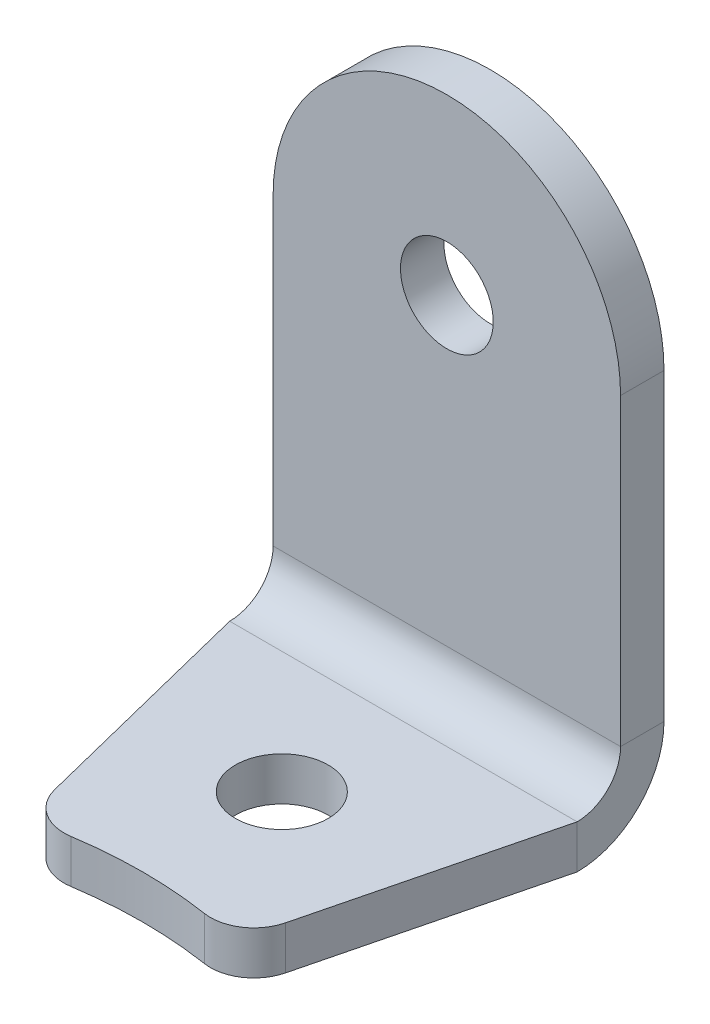
ISO-10303-21;
HEADER;
FILE_DESCRIPTION(('STEP AP214'),'2;1');
FILE_NAME('part.step','',(''),(''),'','','');
FILE_SCHEMA(('AUTOMOTIVE_DESIGN { 1 0 10303 214 1 1 1 1 }'));
ENDSEC;
DATA;
#1=APPLICATION_CONTEXT('core data for automotive mechanical design processes');
#2=APPLICATION_PROTOCOL_DEFINITION('international standard','automotive_design',2000,#1);
#3=PRODUCT_CONTEXT('',#1,'mechanical');
#4=PRODUCT('Part','Part','',(#3));
#5=PRODUCT_RELATED_PRODUCT_CATEGORY('part','',(#4));
#6=PRODUCT_DEFINITION_FORMATION('','',#4);
#7=PRODUCT_DEFINITION_CONTEXT('part definition',#1,'design');
#8=PRODUCT_DEFINITION('design','',#6,#7);
#9=PRODUCT_DEFINITION_SHAPE('','',#8);
#10=(LENGTH_UNIT() NAMED_UNIT(*) SI_UNIT(.MILLI.,.METRE.));
#11=(NAMED_UNIT(*) PLANE_ANGLE_UNIT() SI_UNIT($,.RADIAN.));
#12=(NAMED_UNIT(*) SI_UNIT($,.STERADIAN.) SOLID_ANGLE_UNIT());
#13=UNCERTAINTY_MEASURE_WITH_UNIT(LENGTH_MEASURE(1.E-05),#10,'distance_accuracy_value','');
#14=(GEOMETRIC_REPRESENTATION_CONTEXT(3) GLOBAL_UNCERTAINTY_ASSIGNED_CONTEXT((#13)) GLOBAL_UNIT_ASSIGNED_CONTEXT((#10,
#11,#12)) REPRESENTATION_CONTEXT('',''));
#15=CARTESIAN_POINT('',(0.,0.,0.));
#16=DIRECTION('',(0.,0.,1.));
#17=DIRECTION('',(1.,0.,0.));
#18=AXIS2_PLACEMENT_3D('',#15,#16,#17);
#19=CARTESIAN_POINT('',(-12.7,38.227,-57.1500000000001));
#20=DIRECTION('',(1.,0.,0.));
#21=DIRECTION('',(0.,0.,-1.));
#22=AXIS2_PLACEMENT_3D('',#19,#20,#21);
#23=PLANE('',#22);
#24=DIRECTION('',(0.,0.,-1.));
#25=VECTOR('',#24,1.);
#26=CARTESIAN_POINT('',(-12.7,25.4000000000001,-31.3369777485679));
#27=LINE('',#26,#25);
#28=CARTESIAN_POINT('',(-12.7,25.4,-53.9750000000001));
#29=VERTEX_POINT('',#28);
#30=CARTESIAN_POINT('',(-12.7,25.4,-57.1500000000001));
#31=VERTEX_POINT('',#30);
#32=EDGE_CURVE('E78',#29,#31,#27,.T.);
#33=ORIENTED_EDGE('',*,*,#32,.T.);
#34=DIRECTION('',(0.,1.,0.));
#35=VECTOR('',#34,1.);
#36=CARTESIAN_POINT('',(-12.7,-1.86286761123568E-13,-57.15));
#37=LINE('',#36,#35);
#38=CARTESIAN_POINT('',(-12.7,3.17500000000001,-57.15));
#39=VERTEX_POINT('',#38);
#40=EDGE_CURVE('E152',#39,#31,#37,.T.);
#41=ORIENTED_EDGE('',*,*,#40,.F.);
#42=DIRECTION('',(0.,0.,1.));
#43=VECTOR('',#42,1.);
#44=CARTESIAN_POINT('',(-12.7,3.17499999999999,-53.975));
#45=LINE('',#44,#43);
#46=CARTESIAN_POINT('',(-12.7,3.17499999999996,-53.975));
#47=VERTEX_POINT('',#46);
#48=EDGE_CURVE('E178',#47,#39,#45,.F.);
#49=ORIENTED_EDGE('',*,*,#48,.F.);
#50=DIRECTION('',(0.,-1.,0.));
#51=VECTOR('',#50,1.);
#52=CARTESIAN_POINT('',(-12.7,38.227,-53.9750000000001));
#53=LINE('',#52,#51);
#54=EDGE_CURVE('E154',#47,#29,#53,.F.);
#55=ORIENTED_EDGE('',*,*,#54,.T.);
#56=EDGE_LOOP('',(#33,#41,#49,#55));
#57=FACE_BOUND('',#56,.T.);
#58=ADVANCED_FACE('F63',(#57),#23,.F.);
#59=CARTESIAN_POINT('',(-12.7,-3.175,-50.8));
#60=DIRECTION('',(-0.970142500145332,0.,0.242535625036333));
#61=DIRECTION('',(0.242535625036333,0.,0.970142500145332));
#62=AXIS2_PLACEMENT_3D('',#59,#60,#61);
#63=PLANE('',#62);
#64=DIRECTION('',(0.242535625036333,0.,0.970142500145332));
#65=VECTOR('',#64,1.);
#66=CARTESIAN_POINT('',(-12.7,-3.175,-50.8));
#67=LINE('',#66,#65);
#68=CARTESIAN_POINT('',(-12.7,-3.17500000000003,-50.8));
#69=VERTEX_POINT('',#68);
#70=CARTESIAN_POINT('',(-8.4354817847694,-3.175,-33.7419271390776));
#71=VERTEX_POINT('',#70);
#72=EDGE_CURVE('E214',#69,#71,#67,.T.);
#73=ORIENTED_EDGE('',*,*,#72,.T.);
#74=DIRECTION('',(0.,1.,0.));
#75=VECTOR('',#74,1.);
#76=CARTESIAN_POINT('',(-8.43548178476941,-3.175,-33.7419271390776));
#77=LINE('',#76,#75);
#78=CARTESIAN_POINT('',(-8.4354817847694,0.,-33.7419271390776));
#79=VERTEX_POINT('',#78);
#80=EDGE_CURVE('E72',#71,#79,#77,.T.);
#81=ORIENTED_EDGE('',*,*,#80,.T.);
#82=DIRECTION('',(0.242535625036333,0.,0.970142500145332));
#83=VECTOR('',#82,1.);
#84=CARTESIAN_POINT('',(-12.7,0.,-50.8));
#85=LINE('',#84,#83);
#86=CARTESIAN_POINT('',(-12.7,0.,-50.8));
#87=VERTEX_POINT('',#86);
#88=EDGE_CURVE('E210',#87,#79,#85,.T.);
#89=ORIENTED_EDGE('',*,*,#88,.F.);
#90=DIRECTION('',(0.,1.,0.));
#91=VECTOR('',#90,1.);
#92=CARTESIAN_POINT('',(-12.7,-3.175,-50.8));
#93=LINE('',#92,#91);
#94=EDGE_CURVE('E242',#69,#87,#93,.T.);
#95=ORIENTED_EDGE('',*,*,#94,.F.);
#96=EDGE_LOOP('',(#73,#81,#89,#95));
#97=FACE_BOUND('',#96,.T.);
#98=ADVANCED_FACE('F275',(#97),#63,.T.);
#99=CARTESIAN_POINT('',(12.7,-3.175,-50.8));
#100=DIRECTION('',(0.970142500145332,0.,0.242535625036333));
#101=DIRECTION('',(0.242535625036333,0.,-0.970142500145332));
#102=AXIS2_PLACEMENT_3D('',#99,#100,#101);
#103=PLANE('',#102);
#104=DIRECTION('',(0.242535625036333,0.,-0.970142500145332));
#105=VECTOR('',#104,1.);
#106=CARTESIAN_POINT('',(12.7,0.,-50.8));
#107=LINE('',#106,#105);
#108=CARTESIAN_POINT('',(8.4354817847694,0.,-33.7419271390776));
#109=VERTEX_POINT('',#108);
#110=CARTESIAN_POINT('',(12.7,0.,-50.8));
#111=VERTEX_POINT('',#110);
#112=EDGE_CURVE('E236',#109,#111,#107,.T.);
#113=ORIENTED_EDGE('',*,*,#112,.F.);
#114=DIRECTION('',(0.,1.,0.));
#115=VECTOR('',#114,1.);
#116=CARTESIAN_POINT('',(8.43548178476941,-3.175,-33.7419271390776));
#117=LINE('',#116,#115);
#118=CARTESIAN_POINT('',(8.4354817847694,-3.175,-33.7419271390776));
#119=VERTEX_POINT('',#118);
#120=EDGE_CURVE('E262',#109,#119,#117,.F.);
#121=ORIENTED_EDGE('',*,*,#120,.T.);
#122=DIRECTION('',(0.242535625036333,0.,-0.970142500145332));
#123=VECTOR('',#122,1.);
#124=CARTESIAN_POINT('',(12.7,-3.175,-50.8));
#125=LINE('',#124,#123);
#126=CARTESIAN_POINT('',(12.7,-3.175,-50.8));
#127=VERTEX_POINT('',#126);
#128=EDGE_CURVE('E222',#119,#127,#125,.T.);
#129=ORIENTED_EDGE('',*,*,#128,.T.);
#130=DIRECTION('',(0.,1.,0.));
#131=VECTOR('',#130,1.);
#132=CARTESIAN_POINT('',(12.7,-3.175,-50.8));
#133=LINE('',#132,#131);
#134=EDGE_CURVE('E229',#127,#111,#133,.T.);
#135=ORIENTED_EDGE('',*,*,#134,.T.);
#136=EDGE_LOOP('',(#113,#121,#129,#135));
#137=FACE_BOUND('',#136,.T.);
#138=ADVANCED_FACE('F328',(#137),#103,.T.);
#139=CARTESIAN_POINT('',(0.,-3.175,0.));
#140=DIRECTION('',(0.,1.,0.));
#141=DIRECTION('',(0.,0.,1.));
#142=AXIS2_PLACEMENT_3D('',#139,#140,#141);
#143=CYLINDRICAL_SURFACE('',#142,31.75);
#144=CARTESIAN_POINT('',(0.,-3.175,0.));
#145=DIRECTION('',(0.,-1.,0.));
#146=DIRECTION('',(0.,0.,1.));
#147=AXIS2_PLACEMENT_3D('',#144,#145,#146);
#148=CIRCLE('',#147,31.75);
#149=CARTESIAN_POINT('',(-4.86843576982544,-3.175,-31.3745252259709));
#150=VERTEX_POINT('',#149);
#151=CARTESIAN_POINT('',(4.86843576982544,-3.175,-31.3745252259709));
#152=VERTEX_POINT('',#151);
#153=EDGE_CURVE('E217',#150,#152,#148,.T.);
#154=ORIENTED_EDGE('',*,*,#153,.T.);
#155=DIRECTION('',(0.,1.,0.));
#156=VECTOR('',#155,1.);
#157=CARTESIAN_POINT('',(4.86843576982544,-3.175,-31.3745252259709));
#158=LINE('',#157,#156);
#159=CARTESIAN_POINT('',(4.86843576982544,0.,-31.3745252259709));
#160=VERTEX_POINT('',#159);
#161=EDGE_CURVE('E252',#152,#160,#158,.T.);
#162=ORIENTED_EDGE('',*,*,#161,.T.);
#163=CARTESIAN_POINT('',(0.,0.,0.));
#164=DIRECTION('',(0.,-1.,0.));
#165=DIRECTION('',(0.,0.,1.));
#166=AXIS2_PLACEMENT_3D('',#163,#164,#165);
#167=CIRCLE('',#166,31.75);
#168=CARTESIAN_POINT('',(-4.86843576982544,0.,-31.3745252259709));
#169=VERTEX_POINT('',#168);
#170=EDGE_CURVE('E233',#169,#160,#167,.T.);
#171=ORIENTED_EDGE('',*,*,#170,.F.);
#172=DIRECTION('',(0.,1.,0.));
#173=VECTOR('',#172,1.);
#174=CARTESIAN_POINT('',(-4.86843576982544,-3.175,-31.3745252259709));
#175=LINE('',#174,#173);
#176=EDGE_CURVE('E246',#169,#150,#175,.F.);
#177=ORIENTED_EDGE('',*,*,#176,.T.);
#178=EDGE_LOOP('',(#154,#162,#171,#177));
#179=FACE_BOUND('',#178,.T.);
#180=ADVANCED_FACE('F350',(#179),#143,.F.);
#181=CARTESIAN_POINT('',(0.,-3.175,0.));
#182=DIRECTION('',(0.,1.,0.));
#183=DIRECTION('',(0.,0.,1.));
#184=AXIS2_PLACEMENT_3D('',#181,#182,#183);
#185=PLANE('',#184);
#186=CARTESIAN_POINT('',(0.,-3.175,-41.91));
#187=DIRECTION('',(0.,1.,0.));
#188=DIRECTION('',(0.,0.,1.));
#189=AXIS2_PLACEMENT_3D('',#186,#187,#188);
#190=CIRCLE('',#189,3.3909);
#191=CARTESIAN_POINT('',(0.,-3.175,-38.5191));
#192=VERTEX_POINT('',#191);
#193=EDGE_CURVE('E206',#192,#192,#190,.T.);
#194=ORIENTED_EDGE('',*,*,#193,.T.);
#195=EDGE_LOOP('',(#194));
#196=FACE_BOUND('',#195,.T.);
#197=ORIENTED_EDGE('',*,*,#128,.F.);
#198=CARTESIAN_POINT('',(5.35527934680798,-3.175,-34.511977748568));
#199=DIRECTION('',(0.,1.,0.));
#200=DIRECTION('',(0.,0.,1.));
#201=AXIS2_PLACEMENT_3D('',#198,#199,#200);
#202=CIRCLE('',#201,3.175);
#203=EDGE_CURVE('E267',#119,#152,#202,.F.);
#204=ORIENTED_EDGE('',*,*,#203,.T.);
#205=ORIENTED_EDGE('',*,*,#153,.F.);
#206=CARTESIAN_POINT('',(-5.35527934680798,-3.175,-34.511977748568));
#207=DIRECTION('',(0.,1.,0.));
#208=DIRECTION('',(0.,0.,1.));
#209=AXIS2_PLACEMENT_3D('',#206,#207,#208);
#210=CIRCLE('',#209,3.175);
#211=EDGE_CURVE('E86',#150,#71,#210,.F.);
#212=ORIENTED_EDGE('',*,*,#211,.T.);
#213=ORIENTED_EDGE('',*,*,#72,.F.);
#214=DIRECTION('',(-1.,0.,0.));
#215=VECTOR('',#214,1.);
#216=CARTESIAN_POINT('',(-12.7,-3.175,-50.8));
#217=LINE('',#216,#215);
#218=EDGE_CURVE('E225',#127,#69,#217,.T.);
#219=ORIENTED_EDGE('',*,*,#218,.F.);
#220=EDGE_LOOP('',(#197,#204,#205,#212,#213,#219));
#221=FACE_BOUND('',#220,.T.);
#222=ADVANCED_FACE('F347',(#196,#221),#185,.F.);
#223=CARTESIAN_POINT('',(0.,0.,0.));
#224=DIRECTION('',(0.,1.,0.));
#225=DIRECTION('',(0.,0.,1.));
#226=AXIS2_PLACEMENT_3D('',#223,#224,#225);
#227=PLANE('',#226);
#228=CARTESIAN_POINT('',(0.,0.,-41.91));
#229=DIRECTION('',(0.,1.,0.));
#230=DIRECTION('',(0.,0.,1.));
#231=AXIS2_PLACEMENT_3D('',#228,#229,#230);
#232=CIRCLE('',#231,3.3909);
#233=CARTESIAN_POINT('',(0.,0.,-38.5191));
#234=VERTEX_POINT('',#233);
#235=EDGE_CURVE('E194',#234,#234,#232,.T.);
#236=ORIENTED_EDGE('',*,*,#235,.F.);
#237=EDGE_LOOP('',(#236));
#238=FACE_BOUND('',#237,.T.);
#239=ORIENTED_EDGE('',*,*,#170,.T.);
#240=CARTESIAN_POINT('',(5.35527934680798,0.,-34.511977748568));
#241=DIRECTION('',(0.,1.,0.));
#242=DIRECTION('',(0.,0.,1.));
#243=AXIS2_PLACEMENT_3D('',#240,#241,#242);
#244=CIRCLE('',#243,3.175);
#245=EDGE_CURVE('E259',#160,#109,#244,.T.);
#246=ORIENTED_EDGE('',*,*,#245,.T.);
#247=ORIENTED_EDGE('',*,*,#112,.T.);
#248=DIRECTION('',(-1.,0.,0.));
#249=VECTOR('',#248,1.);
#250=CARTESIAN_POINT('',(-12.7,0.,-50.8));
#251=LINE('',#250,#249);
#252=EDGE_CURVE('E218',#111,#87,#251,.T.);
#253=ORIENTED_EDGE('',*,*,#252,.T.);
#254=ORIENTED_EDGE('',*,*,#88,.T.);
#255=CARTESIAN_POINT('',(-5.35527934680798,0.,-34.511977748568));
#256=DIRECTION('',(0.,1.,0.));
#257=DIRECTION('',(0.,0.,1.));
#258=AXIS2_PLACEMENT_3D('',#255,#256,#257);
#259=CIRCLE('',#258,3.175);
#260=EDGE_CURVE('E256',#79,#169,#259,.T.);
#261=ORIENTED_EDGE('',*,*,#260,.T.);
#262=EDGE_LOOP('',(#239,#246,#247,#253,#254,#261));
#263=FACE_BOUND('',#262,.T.);
#264=ADVANCED_FACE('F279',(#238,#263),#227,.T.);
#265=CARTESIAN_POINT('',(0.,-3.175,-41.91));
#266=DIRECTION('',(0.,1.,0.));
#267=DIRECTION('',(0.,0.,1.));
#268=AXIS2_PLACEMENT_3D('',#265,#266,#267);
#269=CYLINDRICAL_SURFACE('',#268,3.3909);
#270=ORIENTED_EDGE('',*,*,#193,.F.);
#271=EDGE_LOOP('',(#270));
#272=FACE_BOUND('',#271,.T.);
#273=ORIENTED_EDGE('',*,*,#235,.T.);
#274=EDGE_LOOP('',(#273));
#275=FACE_BOUND('',#274,.T.);
#276=ADVANCED_FACE('F340',(#272,#275),#269,.F.);
#277=CARTESIAN_POINT('',(12.7,3.17499999999997,-50.8));
#278=DIRECTION('',(1.,0.,0.));
#279=DIRECTION('',(0.,0.,-1.));
#280=AXIS2_PLACEMENT_3D('',#277,#278,#279);
#281=PLANE('',#280);
#282=DIRECTION('',(0.,0.,1.));
#283=VECTOR('',#282,1.);
#284=CARTESIAN_POINT('',(12.7,3.17500000000001,-57.15));
#285=LINE('',#284,#283);
#286=CARTESIAN_POINT('',(12.7,3.17499999999996,-53.975));
#287=VERTEX_POINT('',#286);
#288=CARTESIAN_POINT('',(12.7,3.17499999999995,-57.15));
#289=VERTEX_POINT('',#288);
#290=EDGE_CURVE('E185',#287,#289,#285,.F.);
#291=ORIENTED_EDGE('',*,*,#290,.F.);
#292=CARTESIAN_POINT('',(12.7,3.17499999999997,-50.8));
#293=DIRECTION('',(-1.,0.,0.));
#294=DIRECTION('',(0.,0.,1.));
#295=AXIS2_PLACEMENT_3D('',#292,#293,#294);
#296=CIRCLE('',#295,3.175);
#297=EDGE_CURVE('E199',#111,#287,#296,.F.);
#298=ORIENTED_EDGE('',*,*,#297,.F.);
#299=ORIENTED_EDGE('',*,*,#134,.F.);
#300=CARTESIAN_POINT('',(12.7,3.17499999999997,-50.8));
#301=DIRECTION('',(-1.,0.,0.));
#302=DIRECTION('',(0.,0.,1.));
#303=AXIS2_PLACEMENT_3D('',#300,#301,#302);
#304=CIRCLE('',#303,6.35);
#305=EDGE_CURVE('E190',#127,#289,#304,.F.);
#306=ORIENTED_EDGE('',*,*,#305,.T.);
#307=EDGE_LOOP('',(#291,#298,#299,#306));
#308=FACE_BOUND('',#307,.T.);
#309=ADVANCED_FACE('F337',(#308),#281,.T.);
#310=CARTESIAN_POINT('',(-12.7,3.17499999999997,-50.8));
#311=DIRECTION('',(1.,0.,0.));
#312=DIRECTION('',(0.,0.,-1.));
#313=AXIS2_PLACEMENT_3D('',#310,#311,#312);
#314=PLANE('',#313);
#315=CARTESIAN_POINT('',(-12.7,3.17499999999997,-50.8));
#316=DIRECTION('',(-1.,0.,0.));
#317=DIRECTION('',(0.,0.,1.));
#318=AXIS2_PLACEMENT_3D('',#315,#316,#317);
#319=CIRCLE('',#318,3.175);
#320=EDGE_CURVE('E169',#47,#87,#319,.T.);
#321=ORIENTED_EDGE('',*,*,#320,.F.);
#322=ORIENTED_EDGE('',*,*,#48,.T.);
#323=CARTESIAN_POINT('',(-12.7,3.17499999999997,-50.8));
#324=DIRECTION('',(-1.,0.,0.));
#325=DIRECTION('',(0.,0.,1.));
#326=AXIS2_PLACEMENT_3D('',#323,#324,#325);
#327=CIRCLE('',#326,6.35);
#328=EDGE_CURVE('E195',#39,#69,#327,.T.);
#329=ORIENTED_EDGE('',*,*,#328,.T.);
#330=ORIENTED_EDGE('',*,*,#94,.T.);
#331=EDGE_LOOP('',(#321,#322,#329,#330));
#332=FACE_BOUND('',#331,.T.);
#333=ADVANCED_FACE('F287',(#332),#314,.F.);
#334=CARTESIAN_POINT('',(-12.7,3.17499999999997,-50.8));
#335=DIRECTION('',(-1.,0.,0.));
#336=DIRECTION('',(0.,0.,-1.));
#337=AXIS2_PLACEMENT_3D('',#334,#335,#336);
#338=CYLINDRICAL_SURFACE('',#337,6.35);
#339=ORIENTED_EDGE('',*,*,#218,.T.);
#340=ORIENTED_EDGE('',*,*,#328,.F.);
#341=DIRECTION('',(-1.,0.,0.));
#342=VECTOR('',#341,1.);
#343=CARTESIAN_POINT('',(12.7,3.17500000000001,-57.15));
#344=LINE('',#343,#342);
#345=EDGE_CURVE('E160',#39,#289,#344,.F.);
#346=ORIENTED_EDGE('',*,*,#345,.T.);
#347=ORIENTED_EDGE('',*,*,#305,.F.);
#348=EDGE_LOOP('',(#339,#340,#346,#347));
#349=FACE_BOUND('',#348,.T.);
#350=ADVANCED_FACE('F331',(#349),#338,.T.);
#351=CARTESIAN_POINT('',(-12.7,3.17499999999997,-50.8));
#352=DIRECTION('',(-1.,0.,0.));
#353=DIRECTION('',(0.,0.,-1.));
#354=AXIS2_PLACEMENT_3D('',#351,#352,#353);
#355=CYLINDRICAL_SURFACE('',#354,3.175);
#356=ORIENTED_EDGE('',*,*,#252,.F.);
#357=ORIENTED_EDGE('',*,*,#297,.T.);
#358=DIRECTION('',(-1.,0.,0.));
#359=VECTOR('',#358,1.);
#360=CARTESIAN_POINT('',(12.7,3.17499999999999,-53.975));
#361=LINE('',#360,#359);
#362=EDGE_CURVE('E182',#287,#47,#361,.T.);
#363=ORIENTED_EDGE('',*,*,#362,.T.);
#364=ORIENTED_EDGE('',*,*,#320,.T.);
#365=EDGE_LOOP('',(#356,#357,#363,#364));
#366=FACE_BOUND('',#365,.T.);
#367=ADVANCED_FACE('F288',(#366),#355,.F.);
#368=CARTESIAN_POINT('',(12.7,0.,-57.15));
#369=DIRECTION('',(-1.,0.,0.));
#370=DIRECTION('',(0.,0.,1.));
#371=AXIS2_PLACEMENT_3D('',#368,#369,#370);
#372=PLANE('',#371);
#373=DIRECTION('',(0.,-1.,0.));
#374=VECTOR('',#373,1.);
#375=CARTESIAN_POINT('',(12.7,-1.86286761123568E-13,-57.15));
#376=LINE('',#375,#374);
#377=CARTESIAN_POINT('',(12.7,25.4,-57.1500000000001));
#378=VERTEX_POINT('',#377);
#379=EDGE_CURVE('E162',#378,#289,#376,.T.);
#380=ORIENTED_EDGE('',*,*,#379,.F.);
#381=DIRECTION('',(0.,0.,-1.));
#382=VECTOR('',#381,1.);
#383=CARTESIAN_POINT('',(12.7,25.4000000000001,-31.3369777485679));
#384=LINE('',#383,#382);
#385=CARTESIAN_POINT('',(12.7,25.4,-53.9750000000001));
#386=VERTEX_POINT('',#385);
#387=EDGE_CURVE('E142',#386,#378,#384,.T.);
#388=ORIENTED_EDGE('',*,*,#387,.F.);
#389=DIRECTION('',(0.,1.,0.));
#390=VECTOR('',#389,1.);
#391=CARTESIAN_POINT('',(12.7,0.,-53.975));
#392=LINE('',#391,#390);
#393=EDGE_CURVE('E163',#386,#287,#392,.F.);
#394=ORIENTED_EDGE('',*,*,#393,.T.);
#395=ORIENTED_EDGE('',*,*,#290,.T.);
#396=EDGE_LOOP('',(#380,#388,#394,#395));
#397=FACE_BOUND('',#396,.T.);
#398=ADVANCED_FACE('F295',(#397),#372,.F.);
#399=CARTESIAN_POINT('',(0.,-1.86286761123568E-13,-57.15));
#400=DIRECTION('',(0.,0.,1.));
#401=DIRECTION('',(0.,-1.,0.));
#402=AXIS2_PLACEMENT_3D('',#399,#400,#401);
#403=PLANE('',#402);
#404=CARTESIAN_POINT('',(0.,25.4,-57.1500000000001));
#405=DIRECTION('',(0.,0.,-1.));
#406=DIRECTION('',(0.,1.,0.));
#407=AXIS2_PLACEMENT_3D('',#404,#405,#406);
#408=CIRCLE('',#407,3.3909);
#409=CARTESIAN_POINT('',(0.,28.7909,-57.1500000000001));
#410=VERTEX_POINT('',#409);
#411=EDGE_CURVE('E298',#410,#410,#408,.T.);
#412=ORIENTED_EDGE('',*,*,#411,.F.);
#413=EDGE_LOOP('',(#412));
#414=FACE_BOUND('',#413,.T.);
#415=ORIENTED_EDGE('',*,*,#40,.T.);
#416=CARTESIAN_POINT('',(0.,25.4,-57.1500000000001));
#417=DIRECTION('',(0.,0.,1.));
#418=DIRECTION('',(0.,1.,0.));
#419=AXIS2_PLACEMENT_3D('',#416,#417,#418);
#420=CIRCLE('',#419,12.7);
#421=EDGE_CURVE('E139',#378,#31,#420,.T.);
#422=ORIENTED_EDGE('',*,*,#421,.F.);
#423=ORIENTED_EDGE('',*,*,#379,.T.);
#424=ORIENTED_EDGE('',*,*,#345,.F.);
#425=EDGE_LOOP('',(#415,#422,#423,#424));
#426=FACE_BOUND('',#425,.T.);
#427=ADVANCED_FACE('F158',(#414,#426),#403,.F.);
#428=CARTESIAN_POINT('',(0.,-1.75201307872741E-13,-53.975));
#429=DIRECTION('',(0.,0.,1.));
#430=DIRECTION('',(0.,-1.,0.));
#431=AXIS2_PLACEMENT_3D('',#428,#429,#430);
#432=PLANE('',#431);
#433=CARTESIAN_POINT('',(0.,25.4,-53.9750000000001));
#434=DIRECTION('',(0.,0.,1.));
#435=DIRECTION('',(0.,-1.,0.));
#436=AXIS2_PLACEMENT_3D('',#433,#434,#435);
#437=CIRCLE('',#436,12.7);
#438=EDGE_CURVE('E13',#29,#386,#437,.F.);
#439=ORIENTED_EDGE('',*,*,#438,.F.);
#440=ORIENTED_EDGE('',*,*,#54,.F.);
#441=ORIENTED_EDGE('',*,*,#362,.F.);
#442=ORIENTED_EDGE('',*,*,#393,.F.);
#443=EDGE_LOOP('',(#439,#440,#441,#442));
#444=FACE_BOUND('',#443,.T.);
#445=CARTESIAN_POINT('',(0.,25.4,-53.9750000000001));
#446=DIRECTION('',(0.,0.,-1.));
#447=DIRECTION('',(0.,1.,0.));
#448=AXIS2_PLACEMENT_3D('',#445,#446,#447);
#449=CIRCLE('',#448,3.3909);
#450=CARTESIAN_POINT('',(0.,28.7909,-53.9750000000001));
#451=VERTEX_POINT('',#450);
#452=EDGE_CURVE('E189',#451,#451,#449,.T.);
#453=ORIENTED_EDGE('',*,*,#452,.T.);
#454=EDGE_LOOP('',(#453));
#455=FACE_BOUND('',#454,.T.);
#456=ADVANCED_FACE('F292',(#444,#455),#432,.T.);
#457=CARTESIAN_POINT('',(5.35527934680798,-3.175,-34.511977748568));
#458=DIRECTION('',(0.,1.,0.));
#459=DIRECTION('',(0.,0.,1.));
#460=AXIS2_PLACEMENT_3D('',#457,#458,#459);
#461=CYLINDRICAL_SURFACE('',#460,3.175);
#462=ORIENTED_EDGE('',*,*,#203,.F.);
#463=ORIENTED_EDGE('',*,*,#120,.F.);
#464=ORIENTED_EDGE('',*,*,#245,.F.);
#465=ORIENTED_EDGE('',*,*,#161,.F.);
#466=EDGE_LOOP('',(#462,#463,#464,#465));
#467=FACE_BOUND('',#466,.T.);
#468=ADVANCED_FACE('F320',(#467),#461,.T.);
#469=CARTESIAN_POINT('',(-5.35527934680798,-3.175,-34.511977748568));
#470=DIRECTION('',(0.,1.,0.));
#471=DIRECTION('',(0.,0.,1.));
#472=AXIS2_PLACEMENT_3D('',#469,#470,#471);
#473=CYLINDRICAL_SURFACE('',#472,3.175);
#474=ORIENTED_EDGE('',*,*,#211,.F.);
#475=ORIENTED_EDGE('',*,*,#176,.F.);
#476=ORIENTED_EDGE('',*,*,#260,.F.);
#477=ORIENTED_EDGE('',*,*,#80,.F.);
#478=EDGE_LOOP('',(#474,#475,#476,#477));
#479=FACE_BOUND('',#478,.T.);
#480=ADVANCED_FACE('F65',(#479),#473,.T.);
#481=CARTESIAN_POINT('',(0.,25.4,-53.9750000000001));
#482=DIRECTION('',(0.,0.,-1.));
#483=DIRECTION('',(0.,1.,0.));
#484=AXIS2_PLACEMENT_3D('',#481,#482,#483);
#485=CYLINDRICAL_SURFACE('',#484,3.3909);
#486=ORIENTED_EDGE('',*,*,#452,.F.);
#487=EDGE_LOOP('',(#486));
#488=FACE_BOUND('',#487,.T.);
#489=ORIENTED_EDGE('',*,*,#411,.T.);
#490=EDGE_LOOP('',(#489));
#491=FACE_BOUND('',#490,.T.);
#492=ADVANCED_FACE('F308',(#488,#491),#485,.F.);
#493=CARTESIAN_POINT('',(0.,25.4000000000001,-31.3369777485679));
#494=DIRECTION('',(0.,0.,-1.));
#495=DIRECTION('',(0.,1.,0.));
#496=AXIS2_PLACEMENT_3D('',#493,#494,#495);
#497=CYLINDRICAL_SURFACE('',#496,12.7);
#498=ORIENTED_EDGE('',*,*,#438,.T.);
#499=ORIENTED_EDGE('',*,*,#387,.T.);
#500=ORIENTED_EDGE('',*,*,#421,.T.);
#501=ORIENTED_EDGE('',*,*,#32,.F.);
#502=EDGE_LOOP('',(#498,#499,#500,#501));
#503=FACE_BOUND('',#502,.T.);
#504=ADVANCED_FACE('F140',(#503),#497,.T.);
#505=CLOSED_SHELL('',(#58,#98,#138,#180,#222,#264,#276,#309,#333,#350,#367,#398,#427,#456,#468,
#480,#492,#504));
#506=MANIFOLD_SOLID_BREP('B2',#505);
#507=ADVANCED_BREP_SHAPE_REPRESENTATION('',(#18,#506),#14);
#508=SHAPE_DEFINITION_REPRESENTATION(#9,#507);
ENDSEC;
END-ISO-10303-21;
